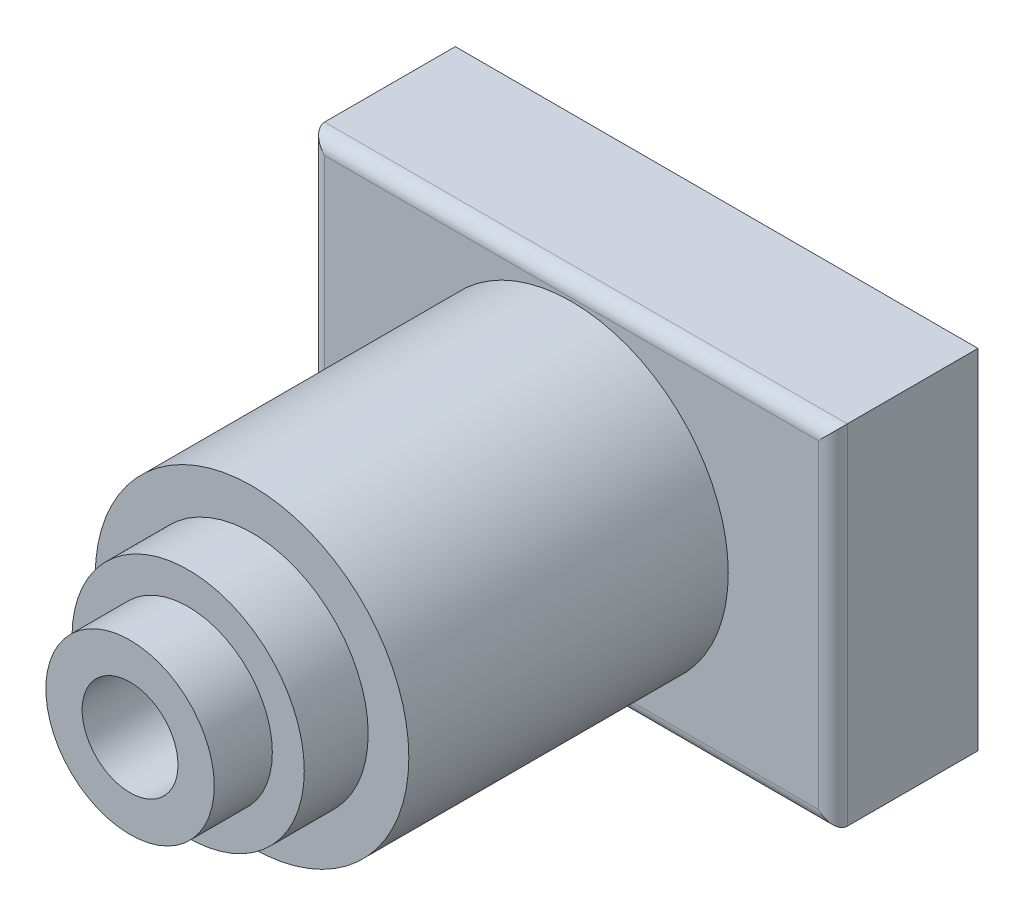
ISO-10303-21;
HEADER;
FILE_DESCRIPTION(('STEP AP214'),'2;1');
FILE_NAME('part.step','',(''),(''),'','','');
FILE_SCHEMA(('AUTOMOTIVE_DESIGN { 1 0 10303 214 1 1 1 1 }'));
ENDSEC;
DATA;
#1=APPLICATION_CONTEXT('core data for automotive mechanical design processes');
#2=APPLICATION_PROTOCOL_DEFINITION('international standard','automotive_design',2000,#1);
#3=PRODUCT_CONTEXT('',#1,'mechanical');
#4=PRODUCT('Part','Part','',(#3));
#5=PRODUCT_RELATED_PRODUCT_CATEGORY('part','',(#4));
#6=PRODUCT_DEFINITION_FORMATION('','',#4);
#7=PRODUCT_DEFINITION_CONTEXT('part definition',#1,'design');
#8=PRODUCT_DEFINITION('design','',#6,#7);
#9=PRODUCT_DEFINITION_SHAPE('','',#8);
#10=(LENGTH_UNIT() NAMED_UNIT(*) SI_UNIT(.MILLI.,.METRE.));
#11=(NAMED_UNIT(*) PLANE_ANGLE_UNIT() SI_UNIT($,.RADIAN.));
#12=(NAMED_UNIT(*) SI_UNIT($,.STERADIAN.) SOLID_ANGLE_UNIT());
#13=UNCERTAINTY_MEASURE_WITH_UNIT(LENGTH_MEASURE(1.E-05),#10,'distance_accuracy_value','');
#14=(GEOMETRIC_REPRESENTATION_CONTEXT(3) GLOBAL_UNCERTAINTY_ASSIGNED_CONTEXT((#13)) GLOBAL_UNIT_ASSIGNED_CONTEXT((#10,
#11,#12)) REPRESENTATION_CONTEXT('',''));
#15=CARTESIAN_POINT('',(0.,0.,0.));
#16=DIRECTION('',(0.,0.,1.));
#17=DIRECTION('',(1.,0.,0.));
#18=AXIS2_PLACEMENT_3D('',#15,#16,#17);
#19=CARTESIAN_POINT('',(0.,0.,-4.80000000000001));
#20=DIRECTION('',(0.,0.,1.));
#21=DIRECTION('',(1.,0.,0.));
#22=AXIS2_PLACEMENT_3D('',#19,#20,#21);
#23=CYLINDRICAL_SURFACE('',#22,1.65);
#24=CARTESIAN_POINT('',(0.,0.,20.2));
#25=DIRECTION('',(0.,0.,1.));
#26=DIRECTION('',(1.,0.,0.));
#27=AXIS2_PLACEMENT_3D('',#24,#25,#26);
#28=CIRCLE('',#27,1.65);
#29=CARTESIAN_POINT('',(1.65,0.,20.2));
#30=VERTEX_POINT('',#29);
#31=EDGE_CURVE('E129',#30,#30,#28,.T.);
#32=CARTESIAN_POINT('',(0.,0.,2.));
#33=DIRECTION('',(0.,0.,-1.));
#34=DIRECTION('',(-1.,0.,0.));
#35=AXIS2_PLACEMENT_3D('',#32,#33,#34);
#36=CIRCLE('',#35,1.65);
#37=CARTESIAN_POINT('',(1.65,0.,2.));
#38=VERTEX_POINT('',#37);
#39=EDGE_CURVE('E126',#38,#38,#36,.F.);
#40=CARTESIAN_POINT('',(1.65,0.,20.2));
#41=CARTESIAN_POINT('',(1.65,0.,20.0104166666667));
#42=CARTESIAN_POINT('',(1.65,0.,19.8208333333333));
#43=CARTESIAN_POINT('',(1.65,0.,19.4416666666667));
#44=CARTESIAN_POINT('',(1.65,0.,19.2520833333333));
#45=CARTESIAN_POINT('',(1.65,0.,18.8729166666667));
#46=CARTESIAN_POINT('',(1.65,0.,18.6833333333333));
#47=CARTESIAN_POINT('',(1.65,0.,18.3041666666667));
#48=CARTESIAN_POINT('',(1.65,0.,18.1145833333333));
#49=CARTESIAN_POINT('',(1.65,0.,17.7354166666667));
#50=CARTESIAN_POINT('',(1.65,0.,17.5458333333333));
#51=CARTESIAN_POINT('',(1.65,0.,17.1666666666667));
#52=CARTESIAN_POINT('',(1.65,0.,16.9770833333333));
#53=CARTESIAN_POINT('',(1.65,0.,16.5979166666667));
#54=CARTESIAN_POINT('',(1.65,0.,16.4083333333333));
#55=CARTESIAN_POINT('',(1.65,0.,16.0291666666667));
#56=CARTESIAN_POINT('',(1.65,0.,15.8395833333333));
#57=CARTESIAN_POINT('',(1.65,0.,15.4604166666667));
#58=CARTESIAN_POINT('',(1.65,0.,15.2708333333333));
#59=CARTESIAN_POINT('',(1.65,0.,14.8916666666667));
#60=CARTESIAN_POINT('',(1.65,0.,14.7020833333333));
#61=CARTESIAN_POINT('',(1.65,0.,14.3229166666667));
#62=CARTESIAN_POINT('',(1.65,0.,14.1333333333333));
#63=CARTESIAN_POINT('',(1.65,0.,13.7541666666667));
#64=CARTESIAN_POINT('',(1.65,0.,13.5645833333333));
#65=CARTESIAN_POINT('',(1.65,0.,13.1854166666667));
#66=CARTESIAN_POINT('',(1.65,0.,12.9958333333333));
#67=CARTESIAN_POINT('',(1.65,0.,12.6166666666667));
#68=CARTESIAN_POINT('',(1.65,0.,12.4270833333333));
#69=CARTESIAN_POINT('',(1.65,0.,12.0479166666667));
#70=CARTESIAN_POINT('',(1.65,0.,11.8583333333333));
#71=CARTESIAN_POINT('',(1.65,0.,11.4791666666667));
#72=CARTESIAN_POINT('',(1.65,0.,11.2895833333333));
#73=CARTESIAN_POINT('',(1.65,0.,10.9104166666667));
#74=CARTESIAN_POINT('',(1.65,0.,10.7208333333333));
#75=CARTESIAN_POINT('',(1.65,0.,10.3416666666667));
#76=CARTESIAN_POINT('',(1.65,0.,10.1520833333333));
#77=CARTESIAN_POINT('',(1.65,0.,9.77291666666667));
#78=CARTESIAN_POINT('',(1.65,0.,9.58333333333333));
#79=CARTESIAN_POINT('',(1.65,0.,9.20416666666667));
#80=CARTESIAN_POINT('',(1.65,0.,9.01458333333333));
#81=CARTESIAN_POINT('',(1.65,0.,8.63541666666667));
#82=CARTESIAN_POINT('',(1.65,0.,8.44583333333333));
#83=CARTESIAN_POINT('',(1.65,0.,8.06666666666667));
#84=CARTESIAN_POINT('',(1.65,0.,7.87708333333333));
#85=CARTESIAN_POINT('',(1.65,0.,7.49791666666667));
#86=CARTESIAN_POINT('',(1.65,0.,7.30833333333334));
#87=CARTESIAN_POINT('',(1.65,0.,6.92916666666667));
#88=CARTESIAN_POINT('',(1.65,0.,6.73958333333334));
#89=CARTESIAN_POINT('',(1.65,0.,6.36041666666667));
#90=CARTESIAN_POINT('',(1.65,0.,6.17083333333333));
#91=CARTESIAN_POINT('',(1.65,0.,5.79166666666667));
#92=CARTESIAN_POINT('',(1.65,0.,5.60208333333333));
#93=CARTESIAN_POINT('',(1.65,0.,5.22291666666667));
#94=CARTESIAN_POINT('',(1.65,0.,5.03333333333333));
#95=CARTESIAN_POINT('',(1.65,0.,4.65416666666667));
#96=CARTESIAN_POINT('',(1.65,0.,4.46458333333333));
#97=CARTESIAN_POINT('',(1.65,0.,4.08541666666667));
#98=CARTESIAN_POINT('',(1.65,0.,3.89583333333333));
#99=CARTESIAN_POINT('',(1.65,0.,3.51666666666667));
#100=CARTESIAN_POINT('',(1.65,0.,3.32708333333333));
#101=CARTESIAN_POINT('',(1.65,0.,2.94791666666667));
#102=CARTESIAN_POINT('',(1.65,0.,2.75833333333333));
#103=CARTESIAN_POINT('',(1.65,0.,2.37916666666667));
#104=CARTESIAN_POINT('',(1.65,0.,2.18958333333333));
#105=CARTESIAN_POINT('',(1.65,0.,2.));
#106=B_SPLINE_CURVE_WITH_KNOTS('',3,(#40,#41,#42,#43,#44,#45,#46,#47,#48,#49,#50,#51,#52,#53,
#54,#55,#56,#57,#58,#59,#60,#61,#62,#63,#64,#65,#66,#67,#68,#69,#70,#71,#72,#73,#74,#75,#76,#77,
#78,#79,#80,#81,#82,#83,#84,#85,#86,#87,#88,#89,#90,#91,#92,#93,#94,#95,#96,#97,#98,#99,#100,
#101,#102,#103,#104,#105),.UNSPECIFIED.,.F.,.F.,(4,2,2,2,2,2,2,2,2,2,2,2,2,2,2,2,2,2,2,2,2,2,2,
2,2,2,2,2,2,2,2,2,4),(0.,0.56875,1.1375,1.70625,2.275,2.84375,3.4125,3.98125,4.55,5.11875,
5.6875,6.25625,6.825,7.39375,7.9625,8.53125,9.1,9.66875,10.2375,10.80625,11.375,11.94375,
12.5125,13.08125,13.65,14.21875,14.7875,15.35625,15.925,16.49375,17.0625,17.63125,18.2),.UNSPECIFIED.);
#107=EDGE_CURVE('BSEAM41',#30,#38,#106,.T.);
#108=ORIENTED_EDGE('',*,*,#31,.T.);
#109=ORIENTED_EDGE('',*,*,#39,.F.);
#110=ORIENTED_EDGE('',*,*,#107,.T.);
#111=ORIENTED_EDGE('',*,*,#107,.F.);
#112=EDGE_LOOP('',(#108,#110,#109,#111));
#113=FACE_BOUND('',#112,.T.);
#114=ADVANCED_FACE('F41',(#113),#23,.F.);
#115=CARTESIAN_POINT('',(9.,6.,5.));
#116=DIRECTION('',(-1.,0.,0.));
#117=DIRECTION('',(0.,-1.,0.));
#118=AXIS2_PLACEMENT_3D('',#115,#116,#117);
#119=PLANE('',#118);
#120=DIRECTION('',(0.,0.,-1.));
#121=VECTOR('',#120,1.);
#122=CARTESIAN_POINT('',(9.,6.,5.));
#123=LINE('',#122,#121);
#124=CARTESIAN_POINT('',(9.,6.,4.5));
#125=VERTEX_POINT('',#124);
#126=CARTESIAN_POINT('',(9.,6.,0.));
#127=VERTEX_POINT('',#126);
#128=EDGE_CURVE('E92',#125,#127,#123,.T.);
#129=ORIENTED_EDGE('',*,*,#128,.F.);
#130=DIRECTION('',(0.,1.,0.));
#131=VECTOR('',#130,1.);
#132=CARTESIAN_POINT('',(9.,-6.,4.5));
#133=LINE('',#132,#131);
#134=CARTESIAN_POINT('',(9.,-6.,4.5));
#135=VERTEX_POINT('',#134);
#136=EDGE_CURVE('E50',#125,#135,#133,.F.);
#137=ORIENTED_EDGE('',*,*,#136,.T.);
#138=DIRECTION('',(0.,0.,-1.));
#139=VECTOR('',#138,1.);
#140=CARTESIAN_POINT('',(9.,-6.,5.));
#141=LINE('',#140,#139);
#142=CARTESIAN_POINT('',(9.,-6.,0.));
#143=VERTEX_POINT('',#142);
#144=EDGE_CURVE('E110',#135,#143,#141,.T.);
#145=ORIENTED_EDGE('',*,*,#144,.T.);
#146=DIRECTION('',(0.,1.,0.));
#147=VECTOR('',#146,1.);
#148=CARTESIAN_POINT('',(9.,6.,0.));
#149=LINE('',#148,#147);
#150=EDGE_CURVE('E105',#143,#127,#149,.T.);
#151=ORIENTED_EDGE('',*,*,#150,.T.);
#152=EDGE_LOOP('',(#129,#137,#145,#151));
#153=FACE_BOUND('',#152,.T.);
#154=ADVANCED_FACE('F109',(#153),#119,.F.);
#155=CARTESIAN_POINT('',(-9.,6.,5.));
#156=DIRECTION('',(0.,-1.,0.));
#157=DIRECTION('',(0.,0.,-1.));
#158=AXIS2_PLACEMENT_3D('',#155,#156,#157);
#159=PLANE('',#158);
#160=DIRECTION('',(0.,0.,-1.));
#161=VECTOR('',#160,1.);
#162=CARTESIAN_POINT('',(-9.,6.,5.));
#163=LINE('',#162,#161);
#164=CARTESIAN_POINT('',(-9.,6.,4.5));
#165=VERTEX_POINT('',#164);
#166=CARTESIAN_POINT('',(-9.,6.,0.));
#167=VERTEX_POINT('',#166);
#168=EDGE_CURVE('E99',#165,#167,#163,.T.);
#169=ORIENTED_EDGE('',*,*,#168,.F.);
#170=DIRECTION('',(-1.,0.,0.));
#171=VECTOR('',#170,1.);
#172=CARTESIAN_POINT('',(9.,6.,4.5));
#173=LINE('',#172,#171);
#174=EDGE_CURVE('E11',#165,#125,#173,.F.);
#175=ORIENTED_EDGE('',*,*,#174,.T.);
#176=ORIENTED_EDGE('',*,*,#128,.T.);
#177=DIRECTION('',(-1.,0.,0.));
#178=VECTOR('',#177,1.);
#179=CARTESIAN_POINT('',(-9.,6.,0.));
#180=LINE('',#179,#178);
#181=EDGE_CURVE('E95',#127,#167,#180,.T.);
#182=ORIENTED_EDGE('',*,*,#181,.T.);
#183=EDGE_LOOP('',(#169,#175,#176,#182));
#184=FACE_BOUND('',#183,.T.);
#185=ADVANCED_FACE('F94',(#184),#159,.F.);
#186=CARTESIAN_POINT('',(-9.,6.,5.));
#187=DIRECTION('',(1.,0.,0.));
#188=DIRECTION('',(0.,1.,0.));
#189=AXIS2_PLACEMENT_3D('',#186,#187,#188);
#190=PLANE('',#189);
#191=DIRECTION('',(0.,0.,-1.));
#192=VECTOR('',#191,1.);
#193=CARTESIAN_POINT('',(-9.,-6.,5.));
#194=LINE('',#193,#192);
#195=CARTESIAN_POINT('',(-9.,-6.,4.5));
#196=VERTEX_POINT('',#195);
#197=CARTESIAN_POINT('',(-9.,-6.,0.));
#198=VERTEX_POINT('',#197);
#199=EDGE_CURVE('E123',#196,#198,#194,.T.);
#200=ORIENTED_EDGE('',*,*,#199,.F.);
#201=DIRECTION('',(0.,-1.,0.));
#202=VECTOR('',#201,1.);
#203=CARTESIAN_POINT('',(-9.,6.,4.5));
#204=LINE('',#203,#202);
#205=EDGE_CURVE('E141',#196,#165,#204,.F.);
#206=ORIENTED_EDGE('',*,*,#205,.T.);
#207=ORIENTED_EDGE('',*,*,#168,.T.);
#208=DIRECTION('',(0.,-1.,0.));
#209=VECTOR('',#208,1.);
#210=CARTESIAN_POINT('',(-9.,6.,0.));
#211=LINE('',#210,#209);
#212=EDGE_CURVE('E107',#167,#198,#211,.T.);
#213=ORIENTED_EDGE('',*,*,#212,.T.);
#214=EDGE_LOOP('',(#200,#206,#207,#213));
#215=FACE_BOUND('',#214,.T.);
#216=ADVANCED_FACE('F198',(#215),#190,.F.);
#217=CARTESIAN_POINT('',(-9.,-6.,5.));
#218=DIRECTION('',(0.,1.,0.));
#219=DIRECTION('',(0.,0.,1.));
#220=AXIS2_PLACEMENT_3D('',#217,#218,#219);
#221=PLANE('',#220);
#222=ORIENTED_EDGE('',*,*,#144,.F.);
#223=DIRECTION('',(1.,0.,0.));
#224=VECTOR('',#223,1.);
#225=CARTESIAN_POINT('',(-9.,-6.,4.5));
#226=LINE('',#225,#224);
#227=EDGE_CURVE('E144',#135,#196,#226,.F.);
#228=ORIENTED_EDGE('',*,*,#227,.T.);
#229=ORIENTED_EDGE('',*,*,#199,.T.);
#230=DIRECTION('',(1.,0.,0.));
#231=VECTOR('',#230,1.);
#232=CARTESIAN_POINT('',(-9.,-6.,0.));
#233=LINE('',#232,#231);
#234=EDGE_CURVE('E120',#198,#143,#233,.T.);
#235=ORIENTED_EDGE('',*,*,#234,.T.);
#236=EDGE_LOOP('',(#222,#228,#229,#235));
#237=FACE_BOUND('',#236,.T.);
#238=ADVANCED_FACE('F188',(#237),#221,.F.);
#239=CARTESIAN_POINT('',(0.,0.,5.));
#240=DIRECTION('',(0.,0.,1.));
#241=DIRECTION('',(1.,0.,0.));
#242=AXIS2_PLACEMENT_3D('',#239,#240,#241);
#243=PLANE('',#242);
#244=DIRECTION('',(-1.,0.,0.));
#245=VECTOR('',#244,1.);
#246=CARTESIAN_POINT('',(-9.,5.5,5.));
#247=LINE('',#246,#245);
#248=CARTESIAN_POINT('',(8.5,5.5,5.));
#249=VERTEX_POINT('',#248);
#250=CARTESIAN_POINT('',(-8.5,5.5,5.));
#251=VERTEX_POINT('',#250);
#252=EDGE_CURVE('E131',#249,#251,#247,.T.);
#253=ORIENTED_EDGE('',*,*,#252,.T.);
#254=DIRECTION('',(0.,-1.,0.));
#255=VECTOR('',#254,1.);
#256=CARTESIAN_POINT('',(-8.5,-6.,5.));
#257=LINE('',#256,#255);
#258=CARTESIAN_POINT('',(-8.5,-5.5,5.));
#259=VERTEX_POINT('',#258);
#260=EDGE_CURVE('E138',#251,#259,#257,.T.);
#261=ORIENTED_EDGE('',*,*,#260,.T.);
#262=DIRECTION('',(1.,0.,0.));
#263=VECTOR('',#262,1.);
#264=CARTESIAN_POINT('',(9.,-5.5,5.));
#265=LINE('',#264,#263);
#266=CARTESIAN_POINT('',(8.49999999999999,-5.5,5.));
#267=VERTEX_POINT('',#266);
#268=EDGE_CURVE('E136',#259,#267,#265,.T.);
#269=ORIENTED_EDGE('',*,*,#268,.T.);
#270=DIRECTION('',(0.,1.,0.));
#271=VECTOR('',#270,1.);
#272=CARTESIAN_POINT('',(8.5,6.,5.));
#273=LINE('',#272,#271);
#274=EDGE_CURVE('E133',#267,#249,#273,.T.);
#275=ORIENTED_EDGE('',*,*,#274,.T.);
#276=EDGE_LOOP('',(#253,#261,#269,#275));
#277=FACE_BOUND('',#276,.T.);
#278=CARTESIAN_POINT('',(0.,0.,5.));
#279=DIRECTION('',(0.,0.,1.));
#280=DIRECTION('',(1.,0.,0.));
#281=AXIS2_PLACEMENT_3D('',#278,#279,#280);
#282=CIRCLE('',#281,5.4);
#283=CARTESIAN_POINT('',(5.4,0.,5.));
#284=VERTEX_POINT('',#283);
#285=EDGE_CURVE('E98',#284,#284,#282,.T.);
#286=ORIENTED_EDGE('',*,*,#285,.F.);
#287=EDGE_LOOP('',(#286));
#288=FACE_BOUND('',#287,.T.);
#289=ADVANCED_FACE('F186',(#277,#288),#243,.T.);
#290=CARTESIAN_POINT('',(0.,0.,0.));
#291=DIRECTION('',(0.,0.,1.));
#292=DIRECTION('',(1.,0.,0.));
#293=AXIS2_PLACEMENT_3D('',#290,#291,#292);
#294=PLANE('',#293);
#295=CARTESIAN_POINT('',(0.,0.,0.));
#296=DIRECTION('',(0.,0.,-1.));
#297=DIRECTION('',(-1.,0.,0.));
#298=AXIS2_PLACEMENT_3D('',#295,#296,#297);
#299=CIRCLE('',#298,4.5);
#300=CARTESIAN_POINT('',(-4.5,0.,0.));
#301=VERTEX_POINT('',#300);
#302=EDGE_CURVE('E157',#301,#301,#299,.T.);
#303=ORIENTED_EDGE('',*,*,#302,.F.);
#304=EDGE_LOOP('',(#303));
#305=FACE_BOUND('',#304,.T.);
#306=ORIENTED_EDGE('',*,*,#150,.F.);
#307=ORIENTED_EDGE('',*,*,#234,.F.);
#308=ORIENTED_EDGE('',*,*,#212,.F.);
#309=ORIENTED_EDGE('',*,*,#181,.F.);
#310=EDGE_LOOP('',(#306,#307,#308,#309));
#311=FACE_BOUND('',#310,.T.);
#312=ADVANCED_FACE('F103',(#305,#311),#294,.F.);
#313=CARTESIAN_POINT('',(0.,0.,16.));
#314=DIRECTION('',(0.,0.,-1.));
#315=DIRECTION('',(-1.,0.,0.));
#316=AXIS2_PLACEMENT_3D('',#313,#314,#315);
#317=CYLINDRICAL_SURFACE('',#316,5.4);
#318=CARTESIAN_POINT('',(0.,0.,16.));
#319=DIRECTION('',(0.,0.,1.));
#320=DIRECTION('',(1.,0.,0.));
#321=AXIS2_PLACEMENT_3D('',#318,#319,#320);
#322=CIRCLE('',#321,5.4);
#323=CARTESIAN_POINT('',(5.4,0.,16.));
#324=VERTEX_POINT('',#323);
#325=EDGE_CURVE('E112',#324,#324,#322,.T.);
#326=ORIENTED_EDGE('',*,*,#325,.F.);
#327=EDGE_LOOP('',(#326));
#328=FACE_BOUND('',#327,.T.);
#329=ORIENTED_EDGE('',*,*,#285,.T.);
#330=EDGE_LOOP('',(#329));
#331=FACE_BOUND('',#330,.T.);
#332=ADVANCED_FACE('F184',(#328,#331),#317,.T.);
#333=CARTESIAN_POINT('',(0.,0.,16.));
#334=DIRECTION('',(0.,0.,1.));
#335=DIRECTION('',(1.,0.,0.));
#336=AXIS2_PLACEMENT_3D('',#333,#334,#335);
#337=PLANE('',#336);
#338=CARTESIAN_POINT('',(0.,0.,16.));
#339=DIRECTION('',(0.,0.,1.));
#340=DIRECTION('',(1.,0.,0.));
#341=AXIS2_PLACEMENT_3D('',#338,#339,#340);
#342=CIRCLE('',#341,4.);
#343=CARTESIAN_POINT('',(4.,0.,16.));
#344=VERTEX_POINT('',#343);
#345=EDGE_CURVE('E175',#344,#344,#342,.T.);
#346=ORIENTED_EDGE('',*,*,#345,.F.);
#347=EDGE_LOOP('',(#346));
#348=FACE_BOUND('',#347,.T.);
#349=ORIENTED_EDGE('',*,*,#325,.T.);
#350=EDGE_LOOP('',(#349));
#351=FACE_BOUND('',#350,.T.);
#352=ADVANCED_FACE('F230',(#348,#351),#337,.T.);
#353=CARTESIAN_POINT('',(0.,0.,18.2));
#354=DIRECTION('',(0.,0.,-1.));
#355=DIRECTION('',(-1.,0.,0.));
#356=AXIS2_PLACEMENT_3D('',#353,#354,#355);
#357=CYLINDRICAL_SURFACE('',#356,4.);
#358=CARTESIAN_POINT('',(0.,0.,18.2));
#359=DIRECTION('',(0.,0.,1.));
#360=DIRECTION('',(1.,0.,0.));
#361=AXIS2_PLACEMENT_3D('',#358,#359,#360);
#362=CIRCLE('',#361,4.);
#363=CARTESIAN_POINT('',(4.,0.,18.2));
#364=VERTEX_POINT('',#363);
#365=EDGE_CURVE('E115',#364,#364,#362,.T.);
#366=ORIENTED_EDGE('',*,*,#365,.F.);
#367=EDGE_LOOP('',(#366));
#368=FACE_BOUND('',#367,.T.);
#369=ORIENTED_EDGE('',*,*,#345,.T.);
#370=EDGE_LOOP('',(#369));
#371=FACE_BOUND('',#370,.T.);
#372=ADVANCED_FACE('F226',(#368,#371),#357,.T.);
#373=CARTESIAN_POINT('',(0.,0.,18.2));
#374=DIRECTION('',(0.,0.,1.));
#375=DIRECTION('',(1.,0.,0.));
#376=AXIS2_PLACEMENT_3D('',#373,#374,#375);
#377=PLANE('',#376);
#378=CARTESIAN_POINT('',(0.,0.,18.2));
#379=DIRECTION('',(0.,0.,1.));
#380=DIRECTION('',(1.,0.,0.));
#381=AXIS2_PLACEMENT_3D('',#378,#379,#380);
#382=CIRCLE('',#381,2.9);
#383=CARTESIAN_POINT('',(2.9,0.,18.2));
#384=VERTEX_POINT('',#383);
#385=EDGE_CURVE('E134',#384,#384,#382,.T.);
#386=ORIENTED_EDGE('',*,*,#385,.F.);
#387=EDGE_LOOP('',(#386));
#388=FACE_BOUND('',#387,.T.);
#389=ORIENTED_EDGE('',*,*,#365,.T.);
#390=EDGE_LOOP('',(#389));
#391=FACE_BOUND('',#390,.T.);
#392=ADVANCED_FACE('F222',(#388,#391),#377,.T.);
#393=CARTESIAN_POINT('',(0.,0.,20.2));
#394=DIRECTION('',(0.,0.,-1.));
#395=DIRECTION('',(-1.,0.,0.));
#396=AXIS2_PLACEMENT_3D('',#393,#394,#395);
#397=CYLINDRICAL_SURFACE('',#396,2.9);
#398=CARTESIAN_POINT('',(0.,0.,20.2));
#399=DIRECTION('',(0.,0.,1.));
#400=DIRECTION('',(1.,0.,0.));
#401=AXIS2_PLACEMENT_3D('',#398,#399,#400);
#402=CIRCLE('',#401,2.9);
#403=CARTESIAN_POINT('',(2.9,0.,20.2));
#404=VERTEX_POINT('',#403);
#405=EDGE_CURVE('E170',#404,#404,#402,.T.);
#406=ORIENTED_EDGE('',*,*,#405,.F.);
#407=EDGE_LOOP('',(#406));
#408=FACE_BOUND('',#407,.T.);
#409=ORIENTED_EDGE('',*,*,#385,.T.);
#410=EDGE_LOOP('',(#409));
#411=FACE_BOUND('',#410,.T.);
#412=ADVANCED_FACE('F218',(#408,#411),#397,.T.);
#413=CARTESIAN_POINT('',(0.,0.,20.2));
#414=DIRECTION('',(0.,0.,1.));
#415=DIRECTION('',(1.,0.,0.));
#416=AXIS2_PLACEMENT_3D('',#413,#414,#415);
#417=PLANE('',#416);
#418=ORIENTED_EDGE('',*,*,#31,.F.);
#419=EDGE_LOOP('',(#418));
#420=FACE_BOUND('',#419,.T.);
#421=ORIENTED_EDGE('',*,*,#405,.T.);
#422=EDGE_LOOP('',(#421));
#423=FACE_BOUND('',#422,.T.);
#424=ADVANCED_FACE('F215',(#420,#423),#417,.T.);
#425=CARTESIAN_POINT('',(0.,0.,2.));
#426=DIRECTION('',(0.,0.,-1.));
#427=DIRECTION('',(-1.,0.,0.));
#428=AXIS2_PLACEMENT_3D('',#425,#426,#427);
#429=PLANE('',#428);
#430=CARTESIAN_POINT('',(0.,0.,2.));
#431=DIRECTION('',(0.,0.,-1.));
#432=DIRECTION('',(-1.,0.,0.));
#433=AXIS2_PLACEMENT_3D('',#430,#431,#432);
#434=CIRCLE('',#433,4.5);
#435=CARTESIAN_POINT('',(-4.5,0.,2.));
#436=VERTEX_POINT('',#435);
#437=EDGE_CURVE('E130',#436,#436,#434,.T.);
#438=ORIENTED_EDGE('',*,*,#437,.T.);
#439=EDGE_LOOP('',(#438));
#440=FACE_BOUND('',#439,.T.);
#441=ORIENTED_EDGE('',*,*,#39,.T.);
#442=EDGE_LOOP('',(#441));
#443=FACE_BOUND('',#442,.T.);
#444=ADVANCED_FACE('F217',(#440,#443),#429,.T.);
#445=CARTESIAN_POINT('',(0.,0.,2.));
#446=DIRECTION('',(0.,0.,-1.));
#447=DIRECTION('',(-1.,0.,0.));
#448=AXIS2_PLACEMENT_3D('',#445,#446,#447);
#449=CYLINDRICAL_SURFACE('',#448,4.5);
#450=ORIENTED_EDGE('',*,*,#437,.F.);
#451=EDGE_LOOP('',(#450));
#452=FACE_BOUND('',#451,.T.);
#453=ORIENTED_EDGE('',*,*,#302,.T.);
#454=EDGE_LOOP('',(#453));
#455=FACE_BOUND('',#454,.T.);
#456=ADVANCED_FACE('F213',(#452,#455),#449,.F.);
#457=CARTESIAN_POINT('',(8.5,0.,4.5));
#458=DIRECTION('',(0.,-1.,0.));
#459=DIRECTION('',(1.,0.,0.));
#460=AXIS2_PLACEMENT_3D('',#457,#458,#459);
#461=CYLINDRICAL_SURFACE('',#460,0.5);
#462=CARTESIAN_POINT('',(8.5,-5.5,4.5));
#463=DIRECTION('',(-0.707106781186548,-0.707106781186547,0.));
#464=DIRECTION('',(0.707106781186547,-0.707106781186548,0.));
#465=AXIS2_PLACEMENT_3D('',#462,#463,#464);
#466=ELLIPSE('',#465,0.707106781186547,0.5);
#467=EDGE_CURVE('E150',#135,#267,#466,.T.);
#468=ORIENTED_EDGE('',*,*,#467,.F.);
#469=ORIENTED_EDGE('',*,*,#136,.F.);
#470=CARTESIAN_POINT('',(8.5,5.5,4.5));
#471=DIRECTION('',(0.707106781186547,-0.707106781186548,0.));
#472=DIRECTION('',(0.707106781186548,0.707106781186547,0.));
#473=AXIS2_PLACEMENT_3D('',#470,#471,#472);
#474=ELLIPSE('',#473,0.707106781186548,0.5);
#475=EDGE_CURVE('E45',#249,#125,#474,.F.);
#476=ORIENTED_EDGE('',*,*,#475,.F.);
#477=ORIENTED_EDGE('',*,*,#274,.F.);
#478=EDGE_LOOP('',(#468,#469,#476,#477));
#479=FACE_BOUND('',#478,.T.);
#480=ADVANCED_FACE('F43',(#479),#461,.T.);
#481=CARTESIAN_POINT('',(0.,5.5,4.5));
#482=DIRECTION('',(1.,0.,0.));
#483=DIRECTION('',(0.,0.,-1.));
#484=AXIS2_PLACEMENT_3D('',#481,#482,#483);
#485=CYLINDRICAL_SURFACE('',#484,0.5);
#486=ORIENTED_EDGE('',*,*,#475,.T.);
#487=ORIENTED_EDGE('',*,*,#174,.F.);
#488=CARTESIAN_POINT('',(-8.5,5.5,4.5));
#489=DIRECTION('',(0.707106781186547,0.707106781186548,0.));
#490=DIRECTION('',(0.707106781186548,-0.707106781186547,0.));
#491=AXIS2_PLACEMENT_3D('',#488,#489,#490);
#492=ELLIPSE('',#491,0.707106781186548,0.5);
#493=EDGE_CURVE('E149',#251,#165,#492,.F.);
#494=ORIENTED_EDGE('',*,*,#493,.F.);
#495=ORIENTED_EDGE('',*,*,#252,.F.);
#496=EDGE_LOOP('',(#486,#487,#494,#495));
#497=FACE_BOUND('',#496,.T.);
#498=ADVANCED_FACE('F295',(#497),#485,.T.);
#499=CARTESIAN_POINT('',(0.,-5.5,4.5));
#500=DIRECTION('',(-1.,0.,0.));
#501=DIRECTION('',(0.,0.,1.));
#502=AXIS2_PLACEMENT_3D('',#499,#500,#501);
#503=CYLINDRICAL_SURFACE('',#502,0.5);
#504=ORIENTED_EDGE('',*,*,#467,.T.);
#505=ORIENTED_EDGE('',*,*,#268,.F.);
#506=CARTESIAN_POINT('',(-8.5,-5.5,4.5));
#507=DIRECTION('',(-0.707106781186548,0.707106781186547,0.));
#508=DIRECTION('',(-0.707106781186547,-0.707106781186548,0.));
#509=AXIS2_PLACEMENT_3D('',#506,#507,#508);
#510=ELLIPSE('',#509,0.707106781186547,0.5);
#511=EDGE_CURVE('E147',#196,#259,#510,.T.);
#512=ORIENTED_EDGE('',*,*,#511,.F.);
#513=ORIENTED_EDGE('',*,*,#227,.F.);
#514=EDGE_LOOP('',(#504,#505,#512,#513));
#515=FACE_BOUND('',#514,.T.);
#516=ADVANCED_FACE('F304',(#515),#503,.T.);
#517=CARTESIAN_POINT('',(-8.5,0.,4.5));
#518=DIRECTION('',(0.,1.,0.));
#519=DIRECTION('',(-1.,0.,0.));
#520=AXIS2_PLACEMENT_3D('',#517,#518,#519);
#521=CYLINDRICAL_SURFACE('',#520,0.5);
#522=ORIENTED_EDGE('',*,*,#493,.T.);
#523=ORIENTED_EDGE('',*,*,#205,.F.);
#524=ORIENTED_EDGE('',*,*,#511,.T.);
#525=ORIENTED_EDGE('',*,*,#260,.F.);
#526=EDGE_LOOP('',(#522,#523,#524,#525));
#527=FACE_BOUND('',#526,.T.);
#528=ADVANCED_FACE('F312',(#527),#521,.T.);
#529=CLOSED_SHELL('',(#114,#154,#185,#216,#238,#289,#312,#332,#352,#372,#392,#412,#424,#444,
#456,#480,#498,#516,#528));
#530=MANIFOLD_SOLID_BREP('B2',#529);
#531=ADVANCED_BREP_SHAPE_REPRESENTATION('',(#18,#530),#14);
#532=SHAPE_DEFINITION_REPRESENTATION(#9,#531);
ENDSEC;
END-ISO-10303-21;
